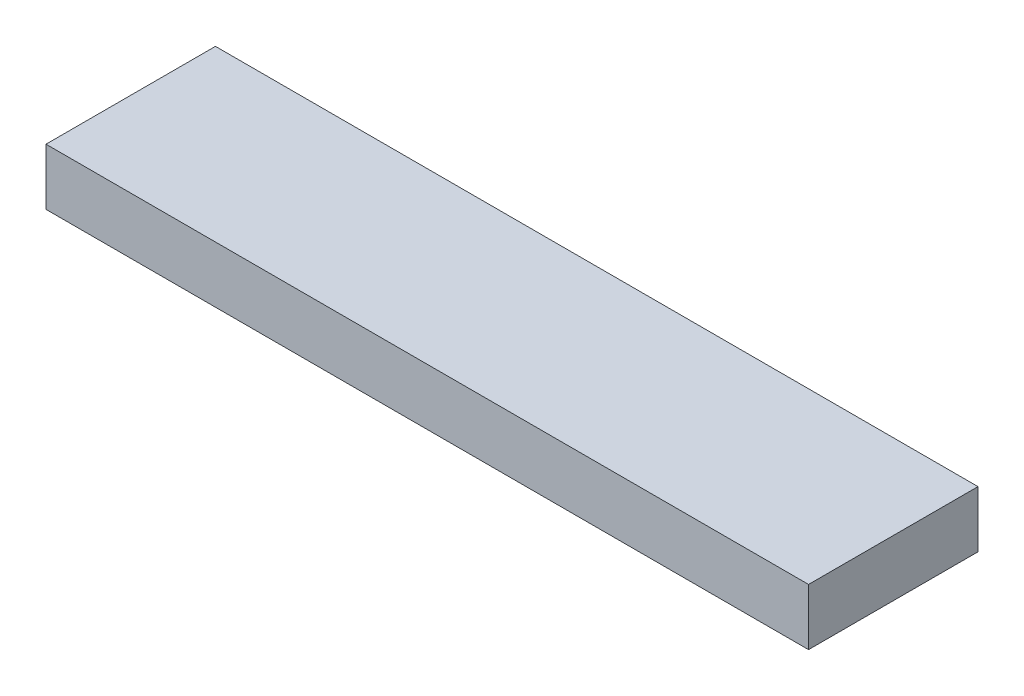
ISO-10303-21;
HEADER;
FILE_DESCRIPTION(('STEP AP214'),'2;1');
FILE_NAME('part.step','',(''),(''),'','','');
FILE_SCHEMA(('AUTOMOTIVE_DESIGN { 1 0 10303 214 1 1 1 1 }'));
ENDSEC;
DATA;
#1=APPLICATION_CONTEXT('core data for automotive mechanical design processes');
#2=APPLICATION_PROTOCOL_DEFINITION('international standard','automotive_design',2000,#1);
#3=PRODUCT_CONTEXT('',#1,'mechanical');
#4=PRODUCT('Part','Part','',(#3));
#5=PRODUCT_RELATED_PRODUCT_CATEGORY('part','',(#4));
#6=PRODUCT_DEFINITION_FORMATION('','',#4);
#7=PRODUCT_DEFINITION_CONTEXT('part definition',#1,'design');
#8=PRODUCT_DEFINITION('design','',#6,#7);
#9=PRODUCT_DEFINITION_SHAPE('','',#8);
#10=(LENGTH_UNIT() NAMED_UNIT(*) SI_UNIT(.MILLI.,.METRE.));
#11=(NAMED_UNIT(*) PLANE_ANGLE_UNIT() SI_UNIT($,.RADIAN.));
#12=(NAMED_UNIT(*) SI_UNIT($,.STERADIAN.) SOLID_ANGLE_UNIT());
#13=UNCERTAINTY_MEASURE_WITH_UNIT(LENGTH_MEASURE(1.E-05),#10,'distance_accuracy_value','');
#14=(GEOMETRIC_REPRESENTATION_CONTEXT(3) GLOBAL_UNCERTAINTY_ASSIGNED_CONTEXT((#13)) GLOBAL_UNIT_ASSIGNED_CONTEXT((#10,
#11,#12)) REPRESENTATION_CONTEXT('',''));
#15=CARTESIAN_POINT('',(0.,0.,0.));
#16=DIRECTION('',(0.,0.,1.));
#17=DIRECTION('',(1.,0.,0.));
#18=AXIS2_PLACEMENT_3D('',#15,#16,#17);
#19=CARTESIAN_POINT('',(-23.4369145959068,6.35,-16.2330827067669));
#20=DIRECTION('',(1.,0.,0.));
#21=DIRECTION('',(0.,0.,-1.));
#22=AXIS2_PLACEMENT_3D('',#19,#20,#21);
#23=PLANE('',#22);
#24=DIRECTION('',(0.,0.,1.));
#25=VECTOR('',#24,1.);
#26=CARTESIAN_POINT('',(-23.4369145959068,0.,-16.2330827067669));
#27=LINE('',#26,#25);
#28=CARTESIAN_POINT('',(-23.4369145959068,0.,-16.2330827067669));
#29=VERTEX_POINT('',#28);
#30=CARTESIAN_POINT('',(-23.4369145959068,0.,2.81691729323308));
#31=VERTEX_POINT('',#30);
#32=EDGE_CURVE('E96',#29,#31,#27,.T.);
#33=ORIENTED_EDGE('',*,*,#32,.T.);
#34=DIRECTION('',(0.,-1.,0.));
#35=VECTOR('',#34,1.);
#36=CARTESIAN_POINT('',(-23.4369145959068,6.35,2.81691729323308));
#37=LINE('',#36,#35);
#38=CARTESIAN_POINT('',(-23.4369145959068,6.35,2.81691729323308));
#39=VERTEX_POINT('',#38);
#40=EDGE_CURVE('E11',#39,#31,#37,.T.);
#41=ORIENTED_EDGE('',*,*,#40,.F.);
#42=DIRECTION('',(0.,0.,1.));
#43=VECTOR('',#42,1.);
#44=CARTESIAN_POINT('',(-23.4369145959068,6.35,-16.2330827067669));
#45=LINE('',#44,#43);
#46=CARTESIAN_POINT('',(-23.4369145959068,6.35,-16.2330827067669));
#47=VERTEX_POINT('',#46);
#48=EDGE_CURVE('E84',#47,#39,#45,.T.);
#49=ORIENTED_EDGE('',*,*,#48,.F.);
#50=DIRECTION('',(0.,-1.,0.));
#51=VECTOR('',#50,1.);
#52=CARTESIAN_POINT('',(-23.4369145959068,6.35,-16.2330827067669));
#53=LINE('',#52,#51);
#54=EDGE_CURVE('E92',#47,#29,#53,.T.);
#55=ORIENTED_EDGE('',*,*,#54,.T.);
#56=EDGE_LOOP('',(#33,#41,#49,#55));
#57=FACE_BOUND('',#56,.T.);
#58=ADVANCED_FACE('F33',(#57),#23,.F.);
#59=CARTESIAN_POINT('',(-23.4369145959068,6.35,2.81691729323308));
#60=DIRECTION('',(0.,0.,-1.));
#61=DIRECTION('',(-1.,0.,0.));
#62=AXIS2_PLACEMENT_3D('',#59,#60,#61);
#63=PLANE('',#62);
#64=DIRECTION('',(1.,0.,0.));
#65=VECTOR('',#64,1.);
#66=CARTESIAN_POINT('',(-23.4369145959068,0.,2.81691729323308));
#67=LINE('',#66,#65);
#68=CARTESIAN_POINT('',(62.2880854040932,0.,2.81691729323308));
#69=VERTEX_POINT('',#68);
#70=EDGE_CURVE('E88',#31,#69,#67,.T.);
#71=ORIENTED_EDGE('',*,*,#70,.T.);
#72=DIRECTION('',(0.,-1.,0.));
#73=VECTOR('',#72,1.);
#74=CARTESIAN_POINT('',(62.2880854040932,6.35,2.81691729323308));
#75=LINE('',#74,#73);
#76=CARTESIAN_POINT('',(62.2880854040932,6.35,2.81691729323308));
#77=VERTEX_POINT('',#76);
#78=EDGE_CURVE('E41',#77,#69,#75,.T.);
#79=ORIENTED_EDGE('',*,*,#78,.F.);
#80=DIRECTION('',(1.,0.,0.));
#81=VECTOR('',#80,1.);
#82=CARTESIAN_POINT('',(-23.4369145959068,6.35,2.81691729323308));
#83=LINE('',#82,#81);
#84=EDGE_CURVE('E79',#39,#77,#83,.T.);
#85=ORIENTED_EDGE('',*,*,#84,.F.);
#86=ORIENTED_EDGE('',*,*,#40,.T.);
#87=EDGE_LOOP('',(#71,#79,#85,#86));
#88=FACE_BOUND('',#87,.T.);
#89=ADVANCED_FACE('F87',(#88),#63,.F.);
#90=CARTESIAN_POINT('',(62.2880854040932,6.35,-16.2330827067669));
#91=DIRECTION('',(-1.,0.,0.));
#92=DIRECTION('',(0.,0.,1.));
#93=AXIS2_PLACEMENT_3D('',#90,#91,#92);
#94=PLANE('',#93);
#95=DIRECTION('',(0.,0.,-1.));
#96=VECTOR('',#95,1.);
#97=CARTESIAN_POINT('',(62.2880854040932,0.,-16.2330827067669));
#98=LINE('',#97,#96);
#99=CARTESIAN_POINT('',(62.2880854040932,0.,-16.2330827067669));
#100=VERTEX_POINT('',#99);
#101=EDGE_CURVE('E66',#69,#100,#98,.T.);
#102=ORIENTED_EDGE('',*,*,#101,.T.);
#103=DIRECTION('',(0.,-1.,0.));
#104=VECTOR('',#103,1.);
#105=CARTESIAN_POINT('',(62.2880854040932,6.35,-16.2330827067669));
#106=LINE('',#105,#104);
#107=CARTESIAN_POINT('',(62.2880854040932,6.35,-16.2330827067669));
#108=VERTEX_POINT('',#107);
#109=EDGE_CURVE('E89',#108,#100,#106,.T.);
#110=ORIENTED_EDGE('',*,*,#109,.F.);
#111=DIRECTION('',(0.,0.,-1.));
#112=VECTOR('',#111,1.);
#113=CARTESIAN_POINT('',(62.2880854040932,6.35,-16.2330827067669));
#114=LINE('',#113,#112);
#115=EDGE_CURVE('E82',#77,#108,#114,.T.);
#116=ORIENTED_EDGE('',*,*,#115,.F.);
#117=ORIENTED_EDGE('',*,*,#78,.T.);
#118=EDGE_LOOP('',(#102,#110,#116,#117));
#119=FACE_BOUND('',#118,.T.);
#120=ADVANCED_FACE('F90',(#119),#94,.F.);
#121=CARTESIAN_POINT('',(-23.4369145959068,6.35,-16.2330827067669));
#122=DIRECTION('',(0.,0.,1.));
#123=DIRECTION('',(1.,0.,0.));
#124=AXIS2_PLACEMENT_3D('',#121,#122,#123);
#125=PLANE('',#124);
#126=DIRECTION('',(-1.,0.,0.));
#127=VECTOR('',#126,1.);
#128=CARTESIAN_POINT('',(-23.4369145959068,0.,-16.2330827067669));
#129=LINE('',#128,#127);
#130=EDGE_CURVE('E72',#100,#29,#129,.T.);
#131=ORIENTED_EDGE('',*,*,#130,.T.);
#132=ORIENTED_EDGE('',*,*,#54,.F.);
#133=DIRECTION('',(-1.,0.,0.));
#134=VECTOR('',#133,1.);
#135=CARTESIAN_POINT('',(-23.4369145959068,6.35,-16.2330827067669));
#136=LINE('',#135,#134);
#137=EDGE_CURVE('E49',#108,#47,#136,.T.);
#138=ORIENTED_EDGE('',*,*,#137,.F.);
#139=ORIENTED_EDGE('',*,*,#109,.T.);
#140=EDGE_LOOP('',(#131,#132,#138,#139));
#141=FACE_BOUND('',#140,.T.);
#142=ADVANCED_FACE('F103',(#141),#125,.F.);
#143=CARTESIAN_POINT('',(0.,6.35,0.));
#144=DIRECTION('',(0.,1.,0.));
#145=DIRECTION('',(0.,0.,1.));
#146=AXIS2_PLACEMENT_3D('',#143,#144,#145);
#147=PLANE('',#146);
#148=ORIENTED_EDGE('',*,*,#48,.T.);
#149=ORIENTED_EDGE('',*,*,#84,.T.);
#150=ORIENTED_EDGE('',*,*,#115,.T.);
#151=ORIENTED_EDGE('',*,*,#137,.T.);
#152=EDGE_LOOP('',(#148,#149,#150,#151));
#153=FACE_BOUND('',#152,.T.);
#154=ADVANCED_FACE('F80',(#153),#147,.T.);
#155=CARTESIAN_POINT('',(0.,0.,0.));
#156=DIRECTION('',(0.,1.,0.));
#157=DIRECTION('',(0.,0.,1.));
#158=AXIS2_PLACEMENT_3D('',#155,#156,#157);
#159=PLANE('',#158);
#160=ORIENTED_EDGE('',*,*,#32,.F.);
#161=ORIENTED_EDGE('',*,*,#130,.F.);
#162=ORIENTED_EDGE('',*,*,#101,.F.);
#163=ORIENTED_EDGE('',*,*,#70,.F.);
#164=EDGE_LOOP('',(#160,#161,#162,#163));
#165=FACE_BOUND('',#164,.T.);
#166=ADVANCED_FACE('F106',(#165),#159,.F.);
#167=CLOSED_SHELL('',(#58,#89,#120,#142,#154,#166));
#168=MANIFOLD_SOLID_BREP('B2',#167);
#169=ADVANCED_BREP_SHAPE_REPRESENTATION('',(#18,#168),#14);
#170=SHAPE_DEFINITION_REPRESENTATION(#9,#169);
ENDSEC;
END-ISO-10303-21;
